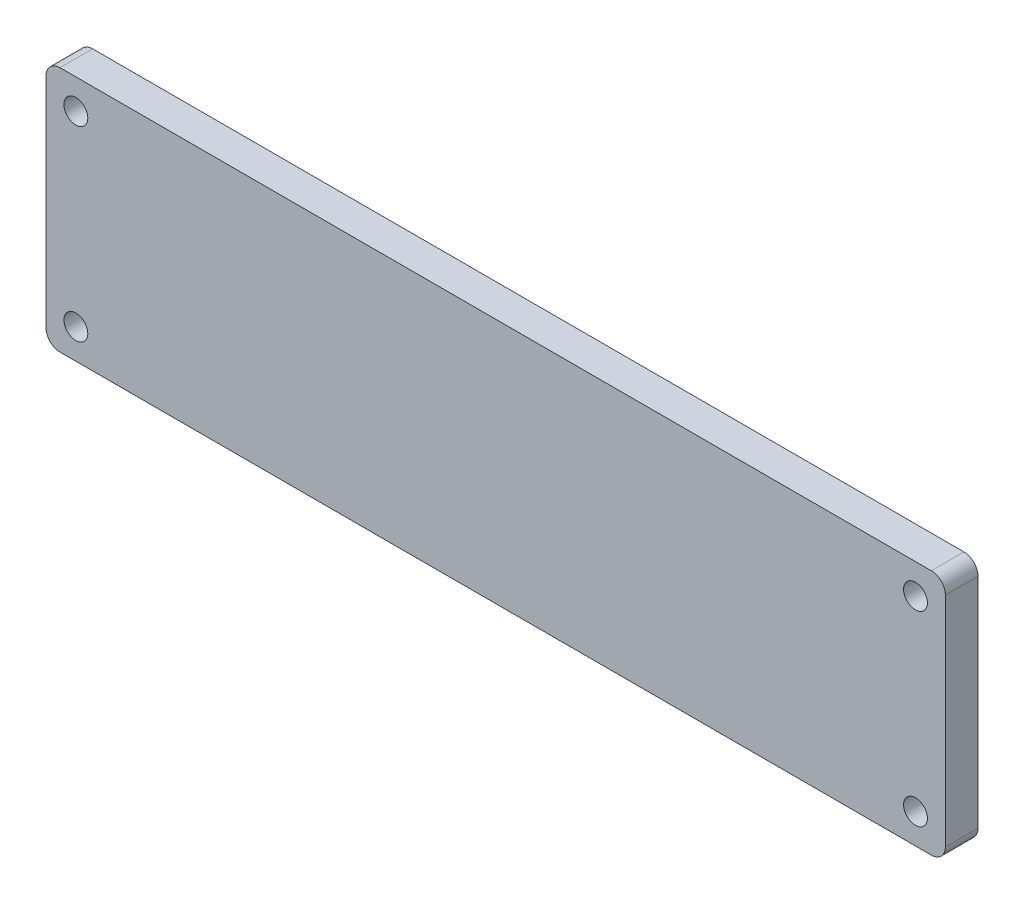
ISO-10303-21;
HEADER;
FILE_DESCRIPTION(('STEP AP214'),'2;1');
FILE_NAME('part.step','',(''),(''),'','','');
FILE_SCHEMA(('AUTOMOTIVE_DESIGN { 1 0 10303 214 1 1 1 1 }'));
ENDSEC;
DATA;
#1=APPLICATION_CONTEXT('core data for automotive mechanical design processes');
#2=APPLICATION_PROTOCOL_DEFINITION('international standard','automotive_design',2000,#1);
#3=PRODUCT_CONTEXT('',#1,'mechanical');
#4=PRODUCT('Part','Part','',(#3));
#5=PRODUCT_RELATED_PRODUCT_CATEGORY('part','',(#4));
#6=PRODUCT_DEFINITION_FORMATION('','',#4);
#7=PRODUCT_DEFINITION_CONTEXT('part definition',#1,'design');
#8=PRODUCT_DEFINITION('design','',#6,#7);
#9=PRODUCT_DEFINITION_SHAPE('','',#8);
#10=(LENGTH_UNIT() NAMED_UNIT(*) SI_UNIT(.MILLI.,.METRE.));
#11=(NAMED_UNIT(*) PLANE_ANGLE_UNIT() SI_UNIT($,.RADIAN.));
#12=(NAMED_UNIT(*) SI_UNIT($,.STERADIAN.) SOLID_ANGLE_UNIT());
#13=UNCERTAINTY_MEASURE_WITH_UNIT(LENGTH_MEASURE(1.E-05),#10,'distance_accuracy_value','');
#14=(GEOMETRIC_REPRESENTATION_CONTEXT(3) GLOBAL_UNCERTAINTY_ASSIGNED_CONTEXT((#13)) GLOBAL_UNIT_ASSIGNED_CONTEXT((#10,
#11,#12)) REPRESENTATION_CONTEXT('',''));
#15=CARTESIAN_POINT('',(0.,0.,0.));
#16=DIRECTION('',(0.,0.,1.));
#17=DIRECTION('',(1.,0.,0.));
#18=AXIS2_PLACEMENT_3D('',#15,#16,#17);
#19=CARTESIAN_POINT('',(46.7,11.7,3.5));
#20=DIRECTION('',(0.,0.,1.));
#21=DIRECTION('',(1.,0.,0.));
#22=AXIS2_PLACEMENT_3D('',#19,#20,#21);
#23=PLANE('',#22);
#24=CARTESIAN_POINT('',(45.,-10.,3.5));
#25=DIRECTION('',(0.,0.,1.));
#26=DIRECTION('',(1.,0.,0.));
#27=AXIS2_PLACEMENT_3D('',#24,#25,#26);
#28=CIRCLE('',#27,1.28);
#29=CARTESIAN_POINT('',(46.28,-10.,3.5));
#30=VERTEX_POINT('',#29);
#31=EDGE_CURVE('E187',#30,#30,#28,.T.);
#32=ORIENTED_EDGE('',*,*,#31,.F.);
#33=EDGE_LOOP('',(#32));
#34=FACE_BOUND('',#33,.T.);
#35=CARTESIAN_POINT('',(-45.,10.,3.5));
#36=DIRECTION('',(0.,0.,1.));
#37=DIRECTION('',(1.,0.,0.));
#38=AXIS2_PLACEMENT_3D('',#35,#36,#37);
#39=CIRCLE('',#38,1.28);
#40=CARTESIAN_POINT('',(-43.72,10.,3.5));
#41=VERTEX_POINT('',#40);
#42=EDGE_CURVE('E133',#41,#41,#39,.T.);
#43=ORIENTED_EDGE('',*,*,#42,.F.);
#44=EDGE_LOOP('',(#43));
#45=FACE_BOUND('',#44,.T.);
#46=CARTESIAN_POINT('',(46.7,11.7,3.5));
#47=DIRECTION('',(0.,0.,1.));
#48=DIRECTION('',(1.,0.,0.));
#49=AXIS2_PLACEMENT_3D('',#46,#47,#48);
#50=CIRCLE('',#49,1.50000000000001);
#51=CARTESIAN_POINT('',(48.2,11.7,3.5));
#52=VERTEX_POINT('',#51);
#53=CARTESIAN_POINT('',(46.7,13.2,3.5));
#54=VERTEX_POINT('',#53);
#55=EDGE_CURVE('E144',#52,#54,#50,.T.);
#56=ORIENTED_EDGE('',*,*,#55,.T.);
#57=DIRECTION('',(-1.,0.,0.));
#58=VECTOR('',#57,1.);
#59=CARTESIAN_POINT('',(-46.7,13.2,3.5));
#60=LINE('',#59,#58);
#61=CARTESIAN_POINT('',(-46.7,13.2,3.5));
#62=VERTEX_POINT('',#61);
#63=EDGE_CURVE('E92',#54,#62,#60,.T.);
#64=ORIENTED_EDGE('',*,*,#63,.T.);
#65=CARTESIAN_POINT('',(-46.7,11.7,3.5));
#66=DIRECTION('',(0.,0.,1.));
#67=DIRECTION('',(-1.,0.,0.));
#68=AXIS2_PLACEMENT_3D('',#65,#66,#67);
#69=CIRCLE('',#68,1.50000000000001);
#70=CARTESIAN_POINT('',(-48.2,11.7,3.5));
#71=VERTEX_POINT('',#70);
#72=EDGE_CURVE('E159',#62,#71,#69,.T.);
#73=ORIENTED_EDGE('',*,*,#72,.T.);
#74=DIRECTION('',(0.,-1.,0.));
#75=VECTOR('',#74,1.);
#76=CARTESIAN_POINT('',(-48.2,11.7,3.5));
#77=LINE('',#76,#75);
#78=CARTESIAN_POINT('',(-48.2,-11.7,3.5));
#79=VERTEX_POINT('',#78);
#80=EDGE_CURVE('E172',#71,#79,#77,.T.);
#81=ORIENTED_EDGE('',*,*,#80,.T.);
#82=CARTESIAN_POINT('',(-46.7,-11.7,3.5));
#83=DIRECTION('',(0.,0.,1.));
#84=DIRECTION('',(-1.,0.,0.));
#85=AXIS2_PLACEMENT_3D('',#82,#83,#84);
#86=CIRCLE('',#85,1.5);
#87=CARTESIAN_POINT('',(-46.7,-13.2,3.5));
#88=VERTEX_POINT('',#87);
#89=EDGE_CURVE('E111',#79,#88,#86,.T.);
#90=ORIENTED_EDGE('',*,*,#89,.T.);
#91=DIRECTION('',(1.,0.,0.));
#92=VECTOR('',#91,1.);
#93=CARTESIAN_POINT('',(-46.7,-13.2,3.5));
#94=LINE('',#93,#92);
#95=CARTESIAN_POINT('',(46.7,-13.2,3.5));
#96=VERTEX_POINT('',#95);
#97=EDGE_CURVE('E105',#88,#96,#94,.T.);
#98=ORIENTED_EDGE('',*,*,#97,.T.);
#99=CARTESIAN_POINT('',(46.7,-11.7,3.5));
#100=DIRECTION('',(0.,0.,1.));
#101=DIRECTION('',(-1.,0.,0.));
#102=AXIS2_PLACEMENT_3D('',#99,#100,#101);
#103=CIRCLE('',#102,1.50000000000001);
#104=CARTESIAN_POINT('',(48.2,-11.7,3.5));
#105=VERTEX_POINT('',#104);
#106=EDGE_CURVE('E109',#96,#105,#103,.T.);
#107=ORIENTED_EDGE('',*,*,#106,.T.);
#108=DIRECTION('',(0.,1.,0.));
#109=VECTOR('',#108,1.);
#110=CARTESIAN_POINT('',(48.2,11.7,3.5));
#111=LINE('',#110,#109);
#112=EDGE_CURVE('E49',#105,#52,#111,.T.);
#113=ORIENTED_EDGE('',*,*,#112,.T.);
#114=EDGE_LOOP('',(#56,#64,#73,#81,#90,#98,#107,#113));
#115=FACE_BOUND('',#114,.T.);
#116=CARTESIAN_POINT('',(45.,10.,3.5));
#117=DIRECTION('',(0.,0.,1.));
#118=DIRECTION('',(1.,0.,0.));
#119=AXIS2_PLACEMENT_3D('',#116,#117,#118);
#120=CIRCLE('',#119,1.28);
#121=CARTESIAN_POINT('',(46.28,10.,3.5));
#122=VERTEX_POINT('',#121);
#123=EDGE_CURVE('E181',#122,#122,#120,.T.);
#124=ORIENTED_EDGE('',*,*,#123,.F.);
#125=EDGE_LOOP('',(#124));
#126=FACE_BOUND('',#125,.T.);
#127=CARTESIAN_POINT('',(-45.,-9.99999999999999,3.5));
#128=DIRECTION('',(0.,0.,1.));
#129=DIRECTION('',(1.,0.,0.));
#130=AXIS2_PLACEMENT_3D('',#127,#128,#129);
#131=CIRCLE('',#130,1.28);
#132=CARTESIAN_POINT('',(-43.72,-9.99999999999999,3.5));
#133=VERTEX_POINT('',#132);
#134=EDGE_CURVE('E193',#133,#133,#131,.T.);
#135=ORIENTED_EDGE('',*,*,#134,.F.);
#136=EDGE_LOOP('',(#135));
#137=FACE_BOUND('',#136,.T.);
#138=ADVANCED_FACE('F32',(#34,#45,#115,#126,#137),#23,.T.);
#139=CARTESIAN_POINT('',(46.7,11.7,0.));
#140=DIRECTION('',(0.,0.,1.));
#141=DIRECTION('',(1.,0.,0.));
#142=AXIS2_PLACEMENT_3D('',#139,#140,#141);
#143=PLANE('',#142);
#144=CARTESIAN_POINT('',(46.7,11.7,0.));
#145=DIRECTION('',(0.,0.,1.));
#146=DIRECTION('',(1.,0.,0.));
#147=AXIS2_PLACEMENT_3D('',#144,#145,#146);
#148=CIRCLE('',#147,1.50000000000001);
#149=CARTESIAN_POINT('',(48.2,11.7,0.));
#150=VERTEX_POINT('',#149);
#151=CARTESIAN_POINT('',(46.7,13.2,0.));
#152=VERTEX_POINT('',#151);
#153=EDGE_CURVE('E129',#150,#152,#148,.T.);
#154=ORIENTED_EDGE('',*,*,#153,.F.);
#155=DIRECTION('',(0.,1.,0.));
#156=VECTOR('',#155,1.);
#157=CARTESIAN_POINT('',(48.2,11.7,0.));
#158=LINE('',#157,#156);
#159=CARTESIAN_POINT('',(48.2,-11.7,0.));
#160=VERTEX_POINT('',#159);
#161=EDGE_CURVE('E84',#160,#150,#158,.T.);
#162=ORIENTED_EDGE('',*,*,#161,.F.);
#163=CARTESIAN_POINT('',(46.7,-11.7,0.));
#164=DIRECTION('',(0.,0.,1.));
#165=DIRECTION('',(-1.,0.,0.));
#166=AXIS2_PLACEMENT_3D('',#163,#164,#165);
#167=CIRCLE('',#166,1.50000000000001);
#168=CARTESIAN_POINT('',(46.7,-13.2,0.));
#169=VERTEX_POINT('',#168);
#170=EDGE_CURVE('E78',#169,#160,#167,.T.);
#171=ORIENTED_EDGE('',*,*,#170,.F.);
#172=DIRECTION('',(1.,0.,0.));
#173=VECTOR('',#172,1.);
#174=CARTESIAN_POINT('',(-46.7,-13.2,0.));
#175=LINE('',#174,#173);
#176=CARTESIAN_POINT('',(-46.7,-13.2,0.));
#177=VERTEX_POINT('',#176);
#178=EDGE_CURVE('E119',#177,#169,#175,.T.);
#179=ORIENTED_EDGE('',*,*,#178,.F.);
#180=CARTESIAN_POINT('',(-46.7,-11.7,0.));
#181=DIRECTION('',(0.,0.,1.));
#182=DIRECTION('',(-1.,0.,0.));
#183=AXIS2_PLACEMENT_3D('',#180,#181,#182);
#184=CIRCLE('',#183,1.5);
#185=CARTESIAN_POINT('',(-48.2,-11.7,0.));
#186=VERTEX_POINT('',#185);
#187=EDGE_CURVE('E139',#186,#177,#184,.T.);
#188=ORIENTED_EDGE('',*,*,#187,.F.);
#189=DIRECTION('',(0.,-1.,0.));
#190=VECTOR('',#189,1.);
#191=CARTESIAN_POINT('',(-48.2,11.7,0.));
#192=LINE('',#191,#190);
#193=CARTESIAN_POINT('',(-48.2,11.7,0.));
#194=VERTEX_POINT('',#193);
#195=EDGE_CURVE('E137',#194,#186,#192,.T.);
#196=ORIENTED_EDGE('',*,*,#195,.F.);
#197=CARTESIAN_POINT('',(-46.7,11.7,0.));
#198=DIRECTION('',(0.,0.,1.));
#199=DIRECTION('',(-1.,0.,0.));
#200=AXIS2_PLACEMENT_3D('',#197,#198,#199);
#201=CIRCLE('',#200,1.50000000000001);
#202=CARTESIAN_POINT('',(-46.7,13.2,0.));
#203=VERTEX_POINT('',#202);
#204=EDGE_CURVE('E135',#203,#194,#201,.T.);
#205=ORIENTED_EDGE('',*,*,#204,.F.);
#206=DIRECTION('',(-1.,0.,0.));
#207=VECTOR('',#206,1.);
#208=CARTESIAN_POINT('',(-46.7,13.2,0.));
#209=LINE('',#208,#207);
#210=EDGE_CURVE('E132',#152,#203,#209,.T.);
#211=ORIENTED_EDGE('',*,*,#210,.F.);
#212=EDGE_LOOP('',(#154,#162,#171,#179,#188,#196,#205,#211));
#213=FACE_BOUND('',#212,.T.);
#214=CARTESIAN_POINT('',(-45.,10.,0.));
#215=DIRECTION('',(0.,0.,1.));
#216=DIRECTION('',(1.,0.,0.));
#217=AXIS2_PLACEMENT_3D('',#214,#215,#216);
#218=CIRCLE('',#217,1.28);
#219=CARTESIAN_POINT('',(-43.72,10.,0.));
#220=VERTEX_POINT('',#219);
#221=EDGE_CURVE('E178',#220,#220,#218,.T.);
#222=ORIENTED_EDGE('',*,*,#221,.T.);
#223=EDGE_LOOP('',(#222));
#224=FACE_BOUND('',#223,.T.);
#225=CARTESIAN_POINT('',(45.,10.,0.));
#226=DIRECTION('',(0.,0.,1.));
#227=DIRECTION('',(1.,0.,0.));
#228=AXIS2_PLACEMENT_3D('',#225,#226,#227);
#229=CIRCLE('',#228,1.28);
#230=CARTESIAN_POINT('',(46.28,10.,0.));
#231=VERTEX_POINT('',#230);
#232=EDGE_CURVE('E184',#231,#231,#229,.T.);
#233=ORIENTED_EDGE('',*,*,#232,.T.);
#234=EDGE_LOOP('',(#233));
#235=FACE_BOUND('',#234,.T.);
#236=CARTESIAN_POINT('',(45.,-10.,0.));
#237=DIRECTION('',(0.,0.,1.));
#238=DIRECTION('',(1.,0.,0.));
#239=AXIS2_PLACEMENT_3D('',#236,#237,#238);
#240=CIRCLE('',#239,1.28);
#241=CARTESIAN_POINT('',(46.28,-10.,0.));
#242=VERTEX_POINT('',#241);
#243=EDGE_CURVE('E190',#242,#242,#240,.T.);
#244=ORIENTED_EDGE('',*,*,#243,.T.);
#245=EDGE_LOOP('',(#244));
#246=FACE_BOUND('',#245,.T.);
#247=CARTESIAN_POINT('',(-45.,-9.99999999999999,0.));
#248=DIRECTION('',(0.,0.,1.));
#249=DIRECTION('',(1.,0.,0.));
#250=AXIS2_PLACEMENT_3D('',#247,#248,#249);
#251=CIRCLE('',#250,1.28);
#252=CARTESIAN_POINT('',(-43.72,-9.99999999999999,0.));
#253=VERTEX_POINT('',#252);
#254=EDGE_CURVE('E196',#253,#253,#251,.T.);
#255=ORIENTED_EDGE('',*,*,#254,.T.);
#256=EDGE_LOOP('',(#255));
#257=FACE_BOUND('',#256,.T.);
#258=ADVANCED_FACE('F163',(#213,#224,#235,#246,#257),#143,.F.);
#259=CARTESIAN_POINT('',(46.7,11.7,3.5));
#260=DIRECTION('',(0.,0.,-1.));
#261=DIRECTION('',(-1.,0.,0.));
#262=AXIS2_PLACEMENT_3D('',#259,#260,#261);
#263=CYLINDRICAL_SURFACE('',#262,1.50000000000001);
#264=ORIENTED_EDGE('',*,*,#153,.T.);
#265=DIRECTION('',(0.,0.,-1.));
#266=VECTOR('',#265,1.);
#267=CARTESIAN_POINT('',(46.7,13.2,3.5));
#268=LINE('',#267,#266);
#269=EDGE_CURVE('E11',#54,#152,#268,.T.);
#270=ORIENTED_EDGE('',*,*,#269,.F.);
#271=ORIENTED_EDGE('',*,*,#55,.F.);
#272=DIRECTION('',(0.,0.,-1.));
#273=VECTOR('',#272,1.);
#274=CARTESIAN_POINT('',(48.2,11.7,3.5));
#275=LINE('',#274,#273);
#276=EDGE_CURVE('E125',#52,#150,#275,.T.);
#277=ORIENTED_EDGE('',*,*,#276,.T.);
#278=EDGE_LOOP('',(#264,#270,#271,#277));
#279=FACE_BOUND('',#278,.T.);
#280=ADVANCED_FACE('F34',(#279),#263,.T.);
#281=CARTESIAN_POINT('',(-46.7,13.2,3.5));
#282=DIRECTION('',(0.,-1.,0.));
#283=DIRECTION('',(1.,0.,0.));
#284=AXIS2_PLACEMENT_3D('',#281,#282,#283);
#285=PLANE('',#284);
#286=ORIENTED_EDGE('',*,*,#210,.T.);
#287=DIRECTION('',(0.,0.,-1.));
#288=VECTOR('',#287,1.);
#289=CARTESIAN_POINT('',(-46.7,13.2,3.5));
#290=LINE('',#289,#288);
#291=EDGE_CURVE('E41',#62,#203,#290,.T.);
#292=ORIENTED_EDGE('',*,*,#291,.F.);
#293=ORIENTED_EDGE('',*,*,#63,.F.);
#294=ORIENTED_EDGE('',*,*,#269,.T.);
#295=EDGE_LOOP('',(#286,#292,#293,#294));
#296=FACE_BOUND('',#295,.T.);
#297=ADVANCED_FACE('F230',(#296),#285,.F.);
#298=CARTESIAN_POINT('',(-46.7,11.7,3.5));
#299=DIRECTION('',(0.,0.,-1.));
#300=DIRECTION('',(-1.,0.,0.));
#301=AXIS2_PLACEMENT_3D('',#298,#299,#300);
#302=CYLINDRICAL_SURFACE('',#301,1.50000000000001);
#303=ORIENTED_EDGE('',*,*,#204,.T.);
#304=DIRECTION('',(0.,0.,-1.));
#305=VECTOR('',#304,1.);
#306=CARTESIAN_POINT('',(-48.2,11.7,3.5));
#307=LINE('',#306,#305);
#308=EDGE_CURVE('E151',#71,#194,#307,.T.);
#309=ORIENTED_EDGE('',*,*,#308,.F.);
#310=ORIENTED_EDGE('',*,*,#72,.F.);
#311=ORIENTED_EDGE('',*,*,#291,.T.);
#312=EDGE_LOOP('',(#303,#309,#310,#311));
#313=FACE_BOUND('',#312,.T.);
#314=ADVANCED_FACE('F157',(#313),#302,.T.);
#315=CARTESIAN_POINT('',(-48.2,11.7,3.5));
#316=DIRECTION('',(1.,0.,0.));
#317=DIRECTION('',(0.,1.,0.));
#318=AXIS2_PLACEMENT_3D('',#315,#316,#317);
#319=PLANE('',#318);
#320=ORIENTED_EDGE('',*,*,#195,.T.);
#321=DIRECTION('',(0.,0.,-1.));
#322=VECTOR('',#321,1.);
#323=CARTESIAN_POINT('',(-48.2,-11.7,3.5));
#324=LINE('',#323,#322);
#325=EDGE_CURVE('E148',#79,#186,#324,.T.);
#326=ORIENTED_EDGE('',*,*,#325,.F.);
#327=ORIENTED_EDGE('',*,*,#80,.F.);
#328=ORIENTED_EDGE('',*,*,#308,.T.);
#329=EDGE_LOOP('',(#320,#326,#327,#328));
#330=FACE_BOUND('',#329,.T.);
#331=ADVANCED_FACE('F168',(#330),#319,.F.);
#332=CARTESIAN_POINT('',(-46.7,-11.7,3.5));
#333=DIRECTION('',(0.,0.,-1.));
#334=DIRECTION('',(-1.,0.,0.));
#335=AXIS2_PLACEMENT_3D('',#332,#333,#334);
#336=CYLINDRICAL_SURFACE('',#335,1.5);
#337=ORIENTED_EDGE('',*,*,#187,.T.);
#338=DIRECTION('',(0.,0.,-1.));
#339=VECTOR('',#338,1.);
#340=CARTESIAN_POINT('',(-46.7,-13.2,3.5));
#341=LINE('',#340,#339);
#342=EDGE_CURVE('E120',#88,#177,#341,.T.);
#343=ORIENTED_EDGE('',*,*,#342,.F.);
#344=ORIENTED_EDGE('',*,*,#89,.F.);
#345=ORIENTED_EDGE('',*,*,#325,.T.);
#346=EDGE_LOOP('',(#337,#343,#344,#345));
#347=FACE_BOUND('',#346,.T.);
#348=ADVANCED_FACE('F171',(#347),#336,.T.);
#349=CARTESIAN_POINT('',(-46.7,-13.2,3.5));
#350=DIRECTION('',(0.,1.,0.));
#351=DIRECTION('',(-1.,0.,0.));
#352=AXIS2_PLACEMENT_3D('',#349,#350,#351);
#353=PLANE('',#352);
#354=ORIENTED_EDGE('',*,*,#178,.T.);
#355=DIRECTION('',(0.,0.,-1.));
#356=VECTOR('',#355,1.);
#357=CARTESIAN_POINT('',(46.7,-13.2,3.5));
#358=LINE('',#357,#356);
#359=EDGE_CURVE('E116',#96,#169,#358,.T.);
#360=ORIENTED_EDGE('',*,*,#359,.F.);
#361=ORIENTED_EDGE('',*,*,#97,.F.);
#362=ORIENTED_EDGE('',*,*,#342,.T.);
#363=EDGE_LOOP('',(#354,#360,#361,#362));
#364=FACE_BOUND('',#363,.T.);
#365=ADVANCED_FACE('F117',(#364),#353,.F.);
#366=CARTESIAN_POINT('',(46.7,-11.7,3.5));
#367=DIRECTION('',(0.,0.,-1.));
#368=DIRECTION('',(-1.,0.,0.));
#369=AXIS2_PLACEMENT_3D('',#366,#367,#368);
#370=CYLINDRICAL_SURFACE('',#369,1.50000000000001);
#371=ORIENTED_EDGE('',*,*,#170,.T.);
#372=DIRECTION('',(0.,0.,-1.));
#373=VECTOR('',#372,1.);
#374=CARTESIAN_POINT('',(48.2,-11.7,3.5));
#375=LINE('',#374,#373);
#376=EDGE_CURVE('E121',#105,#160,#375,.T.);
#377=ORIENTED_EDGE('',*,*,#376,.F.);
#378=ORIENTED_EDGE('',*,*,#106,.F.);
#379=ORIENTED_EDGE('',*,*,#359,.T.);
#380=EDGE_LOOP('',(#371,#377,#378,#379));
#381=FACE_BOUND('',#380,.T.);
#382=ADVANCED_FACE('F123',(#381),#370,.T.);
#383=CARTESIAN_POINT('',(48.2,11.7,3.5));
#384=DIRECTION('',(-1.,0.,0.));
#385=DIRECTION('',(0.,0.,1.));
#386=AXIS2_PLACEMENT_3D('',#383,#384,#385);
#387=PLANE('',#386);
#388=ORIENTED_EDGE('',*,*,#161,.T.);
#389=ORIENTED_EDGE('',*,*,#276,.F.);
#390=ORIENTED_EDGE('',*,*,#112,.F.);
#391=ORIENTED_EDGE('',*,*,#376,.T.);
#392=EDGE_LOOP('',(#388,#389,#390,#391));
#393=FACE_BOUND('',#392,.T.);
#394=ADVANCED_FACE('F218',(#393),#387,.F.);
#395=CARTESIAN_POINT('',(-45.,10.,3.5));
#396=DIRECTION('',(0.,0.,-1.));
#397=DIRECTION('',(-1.,0.,0.));
#398=AXIS2_PLACEMENT_3D('',#395,#396,#397);
#399=CYLINDRICAL_SURFACE('',#398,1.28);
#400=ORIENTED_EDGE('',*,*,#42,.T.);
#401=EDGE_LOOP('',(#400));
#402=FACE_BOUND('',#401,.T.);
#403=ORIENTED_EDGE('',*,*,#221,.F.);
#404=EDGE_LOOP('',(#403));
#405=FACE_BOUND('',#404,.T.);
#406=ADVANCED_FACE('F215',(#402,#405),#399,.F.);
#407=CARTESIAN_POINT('',(45.,10.,3.5));
#408=DIRECTION('',(0.,0.,-1.));
#409=DIRECTION('',(-1.,0.,0.));
#410=AXIS2_PLACEMENT_3D('',#407,#408,#409);
#411=CYLINDRICAL_SURFACE('',#410,1.28);
#412=ORIENTED_EDGE('',*,*,#123,.T.);
#413=EDGE_LOOP('',(#412));
#414=FACE_BOUND('',#413,.T.);
#415=ORIENTED_EDGE('',*,*,#232,.F.);
#416=EDGE_LOOP('',(#415));
#417=FACE_BOUND('',#416,.T.);
#418=ADVANCED_FACE('F294',(#414,#417),#411,.F.);
#419=CARTESIAN_POINT('',(45.,-10.,3.5));
#420=DIRECTION('',(0.,0.,-1.));
#421=DIRECTION('',(-1.,0.,0.));
#422=AXIS2_PLACEMENT_3D('',#419,#420,#421);
#423=CYLINDRICAL_SURFACE('',#422,1.28);
#424=ORIENTED_EDGE('',*,*,#31,.T.);
#425=EDGE_LOOP('',(#424));
#426=FACE_BOUND('',#425,.T.);
#427=ORIENTED_EDGE('',*,*,#243,.F.);
#428=EDGE_LOOP('',(#427));
#429=FACE_BOUND('',#428,.T.);
#430=ADVANCED_FACE('F302',(#426,#429),#423,.F.);
#431=CARTESIAN_POINT('',(-45.,-9.99999999999999,3.5));
#432=DIRECTION('',(0.,0.,-1.));
#433=DIRECTION('',(-1.,0.,0.));
#434=AXIS2_PLACEMENT_3D('',#431,#432,#433);
#435=CYLINDRICAL_SURFACE('',#434,1.28);
#436=ORIENTED_EDGE('',*,*,#134,.T.);
#437=EDGE_LOOP('',(#436));
#438=FACE_BOUND('',#437,.T.);
#439=ORIENTED_EDGE('',*,*,#254,.F.);
#440=EDGE_LOOP('',(#439));
#441=FACE_BOUND('',#440,.T.);
#442=ADVANCED_FACE('F202',(#438,#441),#435,.F.);
#443=CLOSED_SHELL('',(#138,#258,#280,#297,#314,#331,#348,#365,#382,#394,#406,#418,#430,#442));
#444=MANIFOLD_SOLID_BREP('B2',#443);
#445=ADVANCED_BREP_SHAPE_REPRESENTATION('',(#18,#444),#14);
#446=SHAPE_DEFINITION_REPRESENTATION(#9,#445);
ENDSEC;
END-ISO-10303-21;
